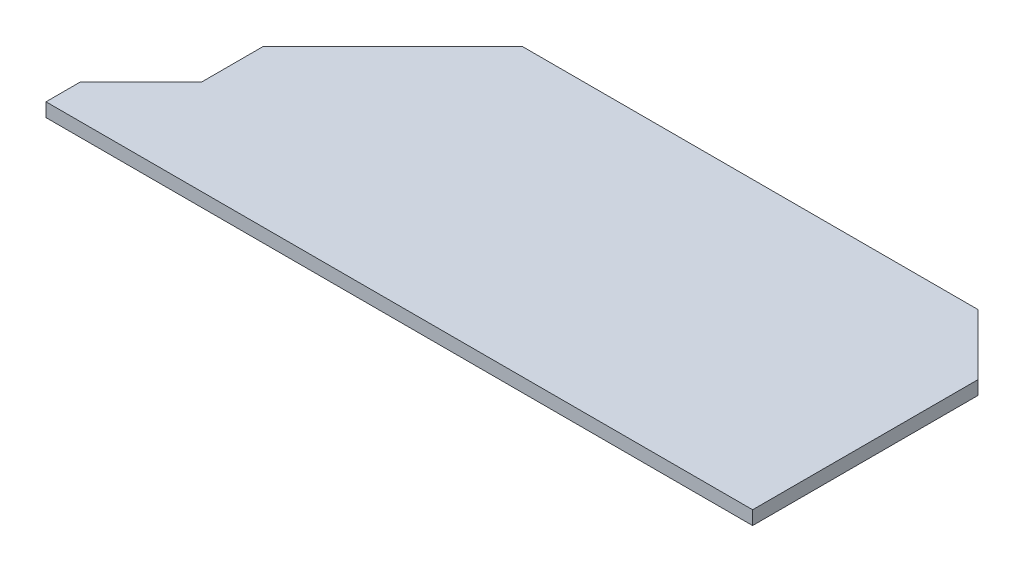
ISO-10303-21;
HEADER;
FILE_DESCRIPTION(('STEP AP214'),'2;1');
FILE_NAME('part.step','',(''),(''),'','','');
FILE_SCHEMA(('AUTOMOTIVE_DESIGN { 1 0 10303 214 1 1 1 1 }'));
ENDSEC;
DATA;
#1=APPLICATION_CONTEXT('core data for automotive mechanical design processes');
#2=APPLICATION_PROTOCOL_DEFINITION('international standard','automotive_design',2000,#1);
#3=PRODUCT_CONTEXT('',#1,'mechanical');
#4=PRODUCT('Part','Part','',(#3));
#5=PRODUCT_RELATED_PRODUCT_CATEGORY('part','',(#4));
#6=PRODUCT_DEFINITION_FORMATION('','',#4);
#7=PRODUCT_DEFINITION_CONTEXT('part definition',#1,'design');
#8=PRODUCT_DEFINITION('design','',#6,#7);
#9=PRODUCT_DEFINITION_SHAPE('','',#8);
#10=(LENGTH_UNIT() NAMED_UNIT(*) SI_UNIT(.MILLI.,.METRE.));
#11=(NAMED_UNIT(*) PLANE_ANGLE_UNIT() SI_UNIT($,.RADIAN.));
#12=(NAMED_UNIT(*) SI_UNIT($,.STERADIAN.) SOLID_ANGLE_UNIT());
#13=UNCERTAINTY_MEASURE_WITH_UNIT(LENGTH_MEASURE(1.E-05),#10,'distance_accuracy_value','');
#14=(GEOMETRIC_REPRESENTATION_CONTEXT(3) GLOBAL_UNCERTAINTY_ASSIGNED_CONTEXT((#13)) GLOBAL_UNIT_ASSIGNED_CONTEXT((#10,
#11,#12)) REPRESENTATION_CONTEXT('',''));
#15=CARTESIAN_POINT('',(0.,0.,0.));
#16=DIRECTION('',(0.,0.,1.));
#17=DIRECTION('',(1.,0.,0.));
#18=AXIS2_PLACEMENT_3D('',#15,#16,#17);
#19=CARTESIAN_POINT('',(0.,0.,0.));
#20=DIRECTION('',(0.,1.,0.));
#21=DIRECTION('',(0.,0.,1.));
#22=AXIS2_PLACEMENT_3D('',#19,#20,#21);
#23=PLANE('',#22);
#24=DIRECTION('',(0.,0.,1.));
#25=VECTOR('',#24,1.);
#26=CARTESIAN_POINT('',(-39.1364538377573,0.,23.6505681818182));
#27=LINE('',#26,#25);
#28=CARTESIAN_POINT('',(-39.1364538377573,0.,23.6505681818182));
#29=VERTEX_POINT('',#28);
#30=CARTESIAN_POINT('',(-39.1364538377573,0.,29.6505681818182));
#31=VERTEX_POINT('',#30);
#32=EDGE_CURVE('E144',#29,#31,#27,.T.);
#33=ORIENTED_EDGE('',*,*,#32,.F.);
#34=DIRECTION('',(-0.707106781186546,0.,0.707106781186549));
#35=VECTOR('',#34,1.);
#36=CARTESIAN_POINT('',(-28.5298521199592,0.,13.04396646402));
#37=LINE('',#36,#35);
#38=CARTESIAN_POINT('',(-28.5298521199592,0.,13.04396646402));
#39=VERTEX_POINT('',#38);
#40=EDGE_CURVE('E157',#39,#29,#37,.T.);
#41=ORIENTED_EDGE('',*,*,#40,.F.);
#42=DIRECTION('',(0.,0.,1.));
#43=VECTOR('',#42,1.);
#44=CARTESIAN_POINT('',(-28.5298521199592,0.,2.27798517978779));
#45=LINE('',#44,#43);
#46=CARTESIAN_POINT('',(-28.5298521199592,0.,2.27798517978779));
#47=VERTEX_POINT('',#46);
#48=EDGE_CURVE('E181',#47,#39,#45,.T.);
#49=ORIENTED_EDGE('',*,*,#48,.F.);
#50=DIRECTION('',(-0.707106781186546,0.,0.707106781186549));
#51=VECTOR('',#50,1.);
#52=CARTESIAN_POINT('',(-5.90243512198968,0.,-20.3494318181818));
#53=LINE('',#52,#51);
#54=CARTESIAN_POINT('',(-5.90243512198968,0.,-20.3494318181818));
#55=VERTEX_POINT('',#54);
#56=EDGE_CURVE('E179',#55,#47,#53,.T.);
#57=ORIENTED_EDGE('',*,*,#56,.F.);
#58=DIRECTION('',(-1.,0.,0.));
#59=VECTOR('',#58,1.);
#60=CARTESIAN_POINT('',(73.7569444444444,0.,-20.3494318181818));
#61=LINE('',#60,#59);
#62=CARTESIAN_POINT('',(73.7569444444444,0.,-20.3494318181818));
#63=VERTEX_POINT('',#62);
#64=EDGE_CURVE('E177',#63,#55,#61,.T.);
#65=ORIENTED_EDGE('',*,*,#64,.F.);
#66=DIRECTION('',(-0.707106781186578,0.,-0.707106781186517));
#67=VECTOR('',#66,1.);
#68=CARTESIAN_POINT('',(84.3635461622431,0.,-9.74283010038406));
#69=LINE('',#68,#67);
#70=CARTESIAN_POINT('',(84.3635461622431,0.,-9.74283010038406));
#71=VERTEX_POINT('',#70);
#72=EDGE_CURVE('E175',#71,#63,#69,.T.);
#73=ORIENTED_EDGE('',*,*,#72,.F.);
#74=DIRECTION('',(0.,0.,-1.));
#75=VECTOR('',#74,1.);
#76=CARTESIAN_POINT('',(84.3635461622427,0.,29.6505681818182));
#77=LINE('',#76,#75);
#78=CARTESIAN_POINT('',(84.3635461622427,0.,29.6505681818182));
#79=VERTEX_POINT('',#78);
#80=EDGE_CURVE('E173',#79,#71,#77,.T.);
#81=ORIENTED_EDGE('',*,*,#80,.F.);
#82=DIRECTION('',(1.,0.,0.));
#83=VECTOR('',#82,1.);
#84=CARTESIAN_POINT('',(-39.1364538377573,0.,29.6505681818182));
#85=LINE('',#84,#83);
#86=EDGE_CURVE('E147',#31,#79,#85,.T.);
#87=ORIENTED_EDGE('',*,*,#86,.F.);
#88=EDGE_LOOP('',(#33,#41,#49,#57,#65,#73,#81,#87));
#89=FACE_BOUND('',#88,.T.);
#90=DIRECTION('',(0.,0.,-1.));
#91=VECTOR('',#90,1.);
#92=CARTESIAN_POINT('',(5.97425278844632,0.,17.8758357515534));
#93=LINE('',#92,#91);
#94=CARTESIAN_POINT('',(5.97425278844632,0.,17.8758357515534));
#95=VERTEX_POINT('',#94);
#96=CARTESIAN_POINT('',(5.97425278844632,0.,10.1924258800352));
#97=VERTEX_POINT('',#96);
#98=EDGE_CURVE('E143',#95,#97,#93,.T.);
#99=ORIENTED_EDGE('',*,*,#98,.F.);
#100=DIRECTION('',(-1.,0.,0.));
#101=VECTOR('',#100,1.);
#102=CARTESIAN_POINT('',(5.97425278844632,0.,17.8758357515534));
#103=LINE('',#102,#101);
#104=CARTESIAN_POINT('',(51.0294500794828,0.,17.8758357515534));
#105=VERTEX_POINT('',#104);
#106=EDGE_CURVE('E140',#105,#95,#103,.T.);
#107=ORIENTED_EDGE('',*,*,#106,.F.);
#108=DIRECTION('',(0.,0.,1.));
#109=VECTOR('',#108,1.);
#110=CARTESIAN_POINT('',(51.0294500794828,0.,17.8758357515534));
#111=LINE('',#110,#109);
#112=CARTESIAN_POINT('',(51.0294500794828,0.,10.1924258800352));
#113=VERTEX_POINT('',#112);
#114=EDGE_CURVE('E54',#113,#105,#111,.T.);
#115=ORIENTED_EDGE('',*,*,#114,.F.);
#116=DIRECTION('',(1.,0.,0.));
#117=VECTOR('',#116,1.);
#118=CARTESIAN_POINT('',(5.97425278844632,0.,10.1924258800352));
#119=LINE('',#118,#117);
#120=EDGE_CURVE('E49',#97,#113,#119,.T.);
#121=ORIENTED_EDGE('',*,*,#120,.F.);
#122=EDGE_LOOP('',(#99,#107,#115,#121));
#123=FACE_BOUND('',#122,.T.);
#124=ADVANCED_FACE('F34',(#89,#123),#23,.F.);
#125=CARTESIAN_POINT('',(-39.1364538377573,2.4,23.6505681818182));
#126=DIRECTION('',(1.,0.,0.));
#127=DIRECTION('',(0.,0.,-1.));
#128=AXIS2_PLACEMENT_3D('',#125,#126,#127);
#129=PLANE('',#128);
#130=ORIENTED_EDGE('',*,*,#32,.T.);
#131=DIRECTION('',(0.,-1.,0.));
#132=VECTOR('',#131,1.);
#133=CARTESIAN_POINT('',(-39.1364538377573,2.4,29.6505681818182));
#134=LINE('',#133,#132);
#135=CARTESIAN_POINT('',(-39.1364538377573,2.4,29.6505681818182));
#136=VERTEX_POINT('',#135);
#137=EDGE_CURVE('E11',#136,#31,#134,.T.);
#138=ORIENTED_EDGE('',*,*,#137,.F.);
#139=DIRECTION('',(0.,0.,1.));
#140=VECTOR('',#139,1.);
#141=CARTESIAN_POINT('',(-39.1364538377573,2.4,23.6505681818182));
#142=LINE('',#141,#140);
#143=CARTESIAN_POINT('',(-39.1364538377573,2.4,23.6505681818182));
#144=VERTEX_POINT('',#143);
#145=EDGE_CURVE('E153',#144,#136,#142,.T.);
#146=ORIENTED_EDGE('',*,*,#145,.F.);
#147=DIRECTION('',(0.,-1.,0.));
#148=VECTOR('',#147,1.);
#149=CARTESIAN_POINT('',(-39.1364538377573,2.4,23.6505681818182));
#150=LINE('',#149,#148);
#151=EDGE_CURVE('E170',#144,#29,#150,.T.);
#152=ORIENTED_EDGE('',*,*,#151,.T.);
#153=EDGE_LOOP('',(#130,#138,#146,#152));
#154=FACE_BOUND('',#153,.T.);
#155=ADVANCED_FACE('F36',(#154),#129,.F.);
#156=CARTESIAN_POINT('',(-39.1364538377573,2.4,29.6505681818182));
#157=DIRECTION('',(0.,0.,-1.));
#158=DIRECTION('',(-1.,0.,0.));
#159=AXIS2_PLACEMENT_3D('',#156,#157,#158);
#160=PLANE('',#159);
#161=ORIENTED_EDGE('',*,*,#86,.T.);
#162=DIRECTION('',(0.,-1.,0.));
#163=VECTOR('',#162,1.);
#164=CARTESIAN_POINT('',(84.3635461622427,2.4,29.6505681818182));
#165=LINE('',#164,#163);
#166=CARTESIAN_POINT('',(84.3635461622427,2.4,29.6505681818182));
#167=VERTEX_POINT('',#166);
#168=EDGE_CURVE('E42',#167,#79,#165,.T.);
#169=ORIENTED_EDGE('',*,*,#168,.F.);
#170=DIRECTION('',(1.,0.,0.));
#171=VECTOR('',#170,1.);
#172=CARTESIAN_POINT('',(-39.1364538377573,2.4,29.6505681818182));
#173=LINE('',#172,#171);
#174=EDGE_CURVE('E156',#136,#167,#173,.T.);
#175=ORIENTED_EDGE('',*,*,#174,.F.);
#176=ORIENTED_EDGE('',*,*,#137,.T.);
#177=EDGE_LOOP('',(#161,#169,#175,#176));
#178=FACE_BOUND('',#177,.T.);
#179=ADVANCED_FACE('F227',(#178),#160,.F.);
#180=CARTESIAN_POINT('',(84.3635461622427,2.4,29.6505681818182));
#181=DIRECTION('',(-1.,0.,0.));
#182=DIRECTION('',(0.,0.,1.));
#183=AXIS2_PLACEMENT_3D('',#180,#181,#182);
#184=PLANE('',#183);
#185=ORIENTED_EDGE('',*,*,#80,.T.);
#186=DIRECTION('',(0.,-1.,0.));
#187=VECTOR('',#186,1.);
#188=CARTESIAN_POINT('',(84.3635461622431,2.4,-9.74283010038406));
#189=LINE('',#188,#187);
#190=CARTESIAN_POINT('',(84.3635461622431,2.4,-9.74283010038406));
#191=VERTEX_POINT('',#190);
#192=EDGE_CURVE('E198',#191,#71,#189,.T.);
#193=ORIENTED_EDGE('',*,*,#192,.F.);
#194=DIRECTION('',(0.,0.,-1.));
#195=VECTOR('',#194,1.);
#196=CARTESIAN_POINT('',(84.3635461622427,2.4,29.6505681818182));
#197=LINE('',#196,#195);
#198=EDGE_CURVE('E159',#167,#191,#197,.T.);
#199=ORIENTED_EDGE('',*,*,#198,.F.);
#200=ORIENTED_EDGE('',*,*,#168,.T.);
#201=EDGE_LOOP('',(#185,#193,#199,#200));
#202=FACE_BOUND('',#201,.T.);
#203=ADVANCED_FACE('F205',(#202),#184,.F.);
#204=CARTESIAN_POINT('',(84.3635461622431,2.4,-9.74283010038406));
#205=DIRECTION('',(-0.707106781186517,0.,0.707106781186578));
#206=DIRECTION('',(0.707106781186578,0.,0.707106781186517));
#207=AXIS2_PLACEMENT_3D('',#204,#205,#206);
#208=PLANE('',#207);
#209=ORIENTED_EDGE('',*,*,#72,.T.);
#210=DIRECTION('',(0.,-1.,0.));
#211=VECTOR('',#210,1.);
#212=CARTESIAN_POINT('',(73.7569444444444,2.4,-20.3494318181818));
#213=LINE('',#212,#211);
#214=CARTESIAN_POINT('',(73.7569444444444,2.4,-20.3494318181818));
#215=VERTEX_POINT('',#214);
#216=EDGE_CURVE('E195',#215,#63,#213,.T.);
#217=ORIENTED_EDGE('',*,*,#216,.F.);
#218=DIRECTION('',(-0.707106781186578,0.,-0.707106781186517));
#219=VECTOR('',#218,1.);
#220=CARTESIAN_POINT('',(84.3635461622431,2.4,-9.74283010038406));
#221=LINE('',#220,#219);
#222=EDGE_CURVE('E161',#191,#215,#221,.T.);
#223=ORIENTED_EDGE('',*,*,#222,.F.);
#224=ORIENTED_EDGE('',*,*,#192,.T.);
#225=EDGE_LOOP('',(#209,#217,#223,#224));
#226=FACE_BOUND('',#225,.T.);
#227=ADVANCED_FACE('F215',(#226),#208,.F.);
#228=CARTESIAN_POINT('',(73.7569444444444,2.4,-20.3494318181818));
#229=DIRECTION('',(0.,0.,1.));
#230=DIRECTION('',(1.,0.,0.));
#231=AXIS2_PLACEMENT_3D('',#228,#229,#230);
#232=PLANE('',#231);
#233=ORIENTED_EDGE('',*,*,#64,.T.);
#234=DIRECTION('',(0.,-1.,0.));
#235=VECTOR('',#234,1.);
#236=CARTESIAN_POINT('',(-5.90243512198968,2.4,-20.3494318181818));
#237=LINE('',#236,#235);
#238=CARTESIAN_POINT('',(-5.90243512198968,2.4,-20.3494318181818));
#239=VERTEX_POINT('',#238);
#240=EDGE_CURVE('E192',#239,#55,#237,.T.);
#241=ORIENTED_EDGE('',*,*,#240,.F.);
#242=DIRECTION('',(-1.,0.,0.));
#243=VECTOR('',#242,1.);
#244=CARTESIAN_POINT('',(73.7569444444444,2.4,-20.3494318181818));
#245=LINE('',#244,#243);
#246=EDGE_CURVE('E163',#215,#239,#245,.T.);
#247=ORIENTED_EDGE('',*,*,#246,.F.);
#248=ORIENTED_EDGE('',*,*,#216,.T.);
#249=EDGE_LOOP('',(#233,#241,#247,#248));
#250=FACE_BOUND('',#249,.T.);
#251=ADVANCED_FACE('F219',(#250),#232,.F.);
#252=CARTESIAN_POINT('',(-5.90243512198968,2.4,-20.3494318181818));
#253=DIRECTION('',(0.707106781186549,0.,0.707106781186546));
#254=DIRECTION('',(0.707106781186546,0.,-0.707106781186549));
#255=AXIS2_PLACEMENT_3D('',#252,#253,#254);
#256=PLANE('',#255);
#257=ORIENTED_EDGE('',*,*,#56,.T.);
#258=DIRECTION('',(0.,-1.,0.));
#259=VECTOR('',#258,1.);
#260=CARTESIAN_POINT('',(-28.5298521199592,2.4,2.27798517978779));
#261=LINE('',#260,#259);
#262=CARTESIAN_POINT('',(-28.5298521199592,2.4,2.27798517978779));
#263=VERTEX_POINT('',#262);
#264=EDGE_CURVE('E189',#263,#47,#261,.T.);
#265=ORIENTED_EDGE('',*,*,#264,.F.);
#266=DIRECTION('',(-0.707106781186546,0.,0.707106781186549));
#267=VECTOR('',#266,1.);
#268=CARTESIAN_POINT('',(-5.90243512198968,2.4,-20.3494318181818));
#269=LINE('',#268,#267);
#270=EDGE_CURVE('E165',#239,#263,#269,.T.);
#271=ORIENTED_EDGE('',*,*,#270,.F.);
#272=ORIENTED_EDGE('',*,*,#240,.T.);
#273=EDGE_LOOP('',(#257,#265,#271,#272));
#274=FACE_BOUND('',#273,.T.);
#275=ADVANCED_FACE('F240',(#274),#256,.F.);
#276=CARTESIAN_POINT('',(-28.5298521199592,2.4,2.27798517978779));
#277=DIRECTION('',(1.,0.,0.));
#278=DIRECTION('',(0.,0.,-1.));
#279=AXIS2_PLACEMENT_3D('',#276,#277,#278);
#280=PLANE('',#279);
#281=ORIENTED_EDGE('',*,*,#48,.T.);
#282=DIRECTION('',(0.,-1.,0.));
#283=VECTOR('',#282,1.);
#284=CARTESIAN_POINT('',(-28.5298521199592,2.4,13.04396646402));
#285=LINE('',#284,#283);
#286=CARTESIAN_POINT('',(-28.5298521199592,2.4,13.04396646402));
#287=VERTEX_POINT('',#286);
#288=EDGE_CURVE('E186',#287,#39,#285,.T.);
#289=ORIENTED_EDGE('',*,*,#288,.F.);
#290=DIRECTION('',(0.,0.,1.));
#291=VECTOR('',#290,1.);
#292=CARTESIAN_POINT('',(-28.5298521199592,2.4,2.27798517978779));
#293=LINE('',#292,#291);
#294=EDGE_CURVE('E167',#263,#287,#293,.T.);
#295=ORIENTED_EDGE('',*,*,#294,.F.);
#296=ORIENTED_EDGE('',*,*,#264,.T.);
#297=EDGE_LOOP('',(#281,#289,#295,#296));
#298=FACE_BOUND('',#297,.T.);
#299=ADVANCED_FACE('F238',(#298),#280,.F.);
#300=CARTESIAN_POINT('',(-28.5298521199592,2.4,13.04396646402));
#301=DIRECTION('',(0.707106781186549,0.,0.707106781186546));
#302=DIRECTION('',(0.707106781186546,0.,-0.707106781186549));
#303=AXIS2_PLACEMENT_3D('',#300,#301,#302);
#304=PLANE('',#303);
#305=ORIENTED_EDGE('',*,*,#40,.T.);
#306=ORIENTED_EDGE('',*,*,#151,.F.);
#307=DIRECTION('',(-0.707106781186546,0.,0.707106781186549));
#308=VECTOR('',#307,1.);
#309=CARTESIAN_POINT('',(-28.5298521199592,2.4,13.04396646402));
#310=LINE('',#309,#308);
#311=EDGE_CURVE('E169',#287,#144,#310,.T.);
#312=ORIENTED_EDGE('',*,*,#311,.F.);
#313=ORIENTED_EDGE('',*,*,#288,.T.);
#314=EDGE_LOOP('',(#305,#306,#312,#313));
#315=FACE_BOUND('',#314,.T.);
#316=ADVANCED_FACE('F233',(#315),#304,.F.);
#317=CARTESIAN_POINT('',(0.,2.4,0.));
#318=DIRECTION('',(0.,1.,0.));
#319=DIRECTION('',(0.,0.,1.));
#320=AXIS2_PLACEMENT_3D('',#317,#318,#319);
#321=PLANE('',#320);
#322=ORIENTED_EDGE('',*,*,#145,.T.);
#323=ORIENTED_EDGE('',*,*,#174,.T.);
#324=ORIENTED_EDGE('',*,*,#198,.T.);
#325=ORIENTED_EDGE('',*,*,#222,.T.);
#326=ORIENTED_EDGE('',*,*,#246,.T.);
#327=ORIENTED_EDGE('',*,*,#270,.T.);
#328=ORIENTED_EDGE('',*,*,#294,.T.);
#329=ORIENTED_EDGE('',*,*,#311,.T.);
#330=EDGE_LOOP('',(#322,#323,#324,#325,#326,#327,#328,#329));
#331=FACE_BOUND('',#330,.T.);
#332=ADVANCED_FACE('F223',(#331),#321,.T.);
#333=CARTESIAN_POINT('',(5.97425278844632,-2.8,17.8758357515534));
#334=DIRECTION('',(1.,0.,0.));
#335=DIRECTION('',(0.,0.,-1.));
#336=AXIS2_PLACEMENT_3D('',#333,#334,#335);
#337=PLANE('',#336);
#338=ORIENTED_EDGE('',*,*,#98,.T.);
#339=DIRECTION('',(0.,1.,0.));
#340=VECTOR('',#339,1.);
#341=CARTESIAN_POINT('',(5.97425278844632,-2.8,10.1924258800352));
#342=LINE('',#341,#340);
#343=CARTESIAN_POINT('',(5.97425278844632,-2.8,10.1924258800352));
#344=VERTEX_POINT('',#343);
#345=EDGE_CURVE('E124',#344,#97,#342,.T.);
#346=ORIENTED_EDGE('',*,*,#345,.F.);
#347=DIRECTION('',(0.,0.,-1.));
#348=VECTOR('',#347,1.);
#349=CARTESIAN_POINT('',(5.97425278844632,-2.8,17.8758357515534));
#350=LINE('',#349,#348);
#351=CARTESIAN_POINT('',(5.97425278844632,-2.8,17.8758357515534));
#352=VERTEX_POINT('',#351);
#353=EDGE_CURVE('E131',#352,#344,#350,.T.);
#354=ORIENTED_EDGE('',*,*,#353,.F.);
#355=DIRECTION('',(0.,1.,0.));
#356=VECTOR('',#355,1.);
#357=CARTESIAN_POINT('',(5.97425278844632,-2.8,17.8758357515534));
#358=LINE('',#357,#356);
#359=EDGE_CURVE('E378',#352,#95,#358,.T.);
#360=ORIENTED_EDGE('',*,*,#359,.T.);
#361=EDGE_LOOP('',(#338,#346,#354,#360));
#362=FACE_BOUND('',#361,.T.);
#363=ADVANCED_FACE('F142',(#362),#337,.F.);
#364=CARTESIAN_POINT('',(5.97425278844632,-2.8,10.1924258800352));
#365=DIRECTION('',(0.,0.,1.));
#366=DIRECTION('',(1.,0.,0.));
#367=AXIS2_PLACEMENT_3D('',#364,#365,#366);
#368=PLANE('',#367);
#369=ORIENTED_EDGE('',*,*,#120,.T.);
#370=DIRECTION('',(0.,1.,0.));
#371=VECTOR('',#370,1.);
#372=CARTESIAN_POINT('',(51.0294500794828,-2.8,10.1924258800352));
#373=LINE('',#372,#371);
#374=CARTESIAN_POINT('',(51.0294500794828,-2.8,10.1924258800352));
#375=VERTEX_POINT('',#374);
#376=EDGE_CURVE('E127',#375,#113,#373,.T.);
#377=ORIENTED_EDGE('',*,*,#376,.F.);
#378=DIRECTION('',(1.,0.,0.));
#379=VECTOR('',#378,1.);
#380=CARTESIAN_POINT('',(5.97425278844632,-2.8,10.1924258800352));
#381=LINE('',#380,#379);
#382=EDGE_CURVE('E120',#344,#375,#381,.T.);
#383=ORIENTED_EDGE('',*,*,#382,.F.);
#384=ORIENTED_EDGE('',*,*,#345,.T.);
#385=EDGE_LOOP('',(#369,#377,#383,#384));
#386=FACE_BOUND('',#385,.T.);
#387=ADVANCED_FACE('F122',(#386),#368,.F.);
#388=CARTESIAN_POINT('',(51.0294500794828,-2.8,17.8758357515534));
#389=DIRECTION('',(-1.,0.,0.));
#390=DIRECTION('',(0.,0.,1.));
#391=AXIS2_PLACEMENT_3D('',#388,#389,#390);
#392=PLANE('',#391);
#393=ORIENTED_EDGE('',*,*,#114,.T.);
#394=DIRECTION('',(0.,1.,0.));
#395=VECTOR('',#394,1.);
#396=CARTESIAN_POINT('',(51.0294500794828,-2.8,17.8758357515534));
#397=LINE('',#396,#395);
#398=CARTESIAN_POINT('',(51.0294500794828,-2.8,17.8758357515534));
#399=VERTEX_POINT('',#398);
#400=EDGE_CURVE('E149',#399,#105,#397,.T.);
#401=ORIENTED_EDGE('',*,*,#400,.F.);
#402=DIRECTION('',(0.,0.,1.));
#403=VECTOR('',#402,1.);
#404=CARTESIAN_POINT('',(51.0294500794828,-2.8,17.8758357515534));
#405=LINE('',#404,#403);
#406=EDGE_CURVE('E130',#375,#399,#405,.T.);
#407=ORIENTED_EDGE('',*,*,#406,.F.);
#408=ORIENTED_EDGE('',*,*,#376,.T.);
#409=EDGE_LOOP('',(#393,#401,#407,#408));
#410=FACE_BOUND('',#409,.T.);
#411=ADVANCED_FACE('F267',(#410),#392,.F.);
#412=CARTESIAN_POINT('',(5.97425278844632,-2.8,17.8758357515534));
#413=DIRECTION('',(0.,0.,-1.));
#414=DIRECTION('',(-1.,0.,0.));
#415=AXIS2_PLACEMENT_3D('',#412,#413,#414);
#416=PLANE('',#415);
#417=ORIENTED_EDGE('',*,*,#106,.T.);
#418=ORIENTED_EDGE('',*,*,#359,.F.);
#419=DIRECTION('',(-1.,0.,0.));
#420=VECTOR('',#419,1.);
#421=CARTESIAN_POINT('',(5.97425278844632,-2.8,17.8758357515534));
#422=LINE('',#421,#420);
#423=EDGE_CURVE('E136',#399,#352,#422,.T.);
#424=ORIENTED_EDGE('',*,*,#423,.F.);
#425=ORIENTED_EDGE('',*,*,#400,.T.);
#426=EDGE_LOOP('',(#417,#418,#424,#425));
#427=FACE_BOUND('',#426,.T.);
#428=ADVANCED_FACE('F272',(#427),#416,.F.);
#429=CARTESIAN_POINT('',(0.,-2.8,0.));
#430=DIRECTION('',(0.,-1.,0.));
#431=DIRECTION('',(0.,0.,-1.));
#432=AXIS2_PLACEMENT_3D('',#429,#430,#431);
#433=PLANE('',#432);
#434=ORIENTED_EDGE('',*,*,#353,.T.);
#435=ORIENTED_EDGE('',*,*,#382,.T.);
#436=ORIENTED_EDGE('',*,*,#406,.T.);
#437=ORIENTED_EDGE('',*,*,#423,.T.);
#438=EDGE_LOOP('',(#434,#435,#436,#437));
#439=FACE_BOUND('',#438,.T.);
#440=ADVANCED_FACE('F134',(#439),#433,.T.);
#441=CLOSED_SHELL('',(#124,#155,#179,#203,#227,#251,#275,#299,#316,#332,#363,#387,#411,#428,#440));
#442=MANIFOLD_SOLID_BREP('B2',#441);
#443=ADVANCED_BREP_SHAPE_REPRESENTATION('',(#18,#442),#14);
#444=SHAPE_DEFINITION_REPRESENTATION(#9,#443);
ENDSEC;
END-ISO-10303-21;
